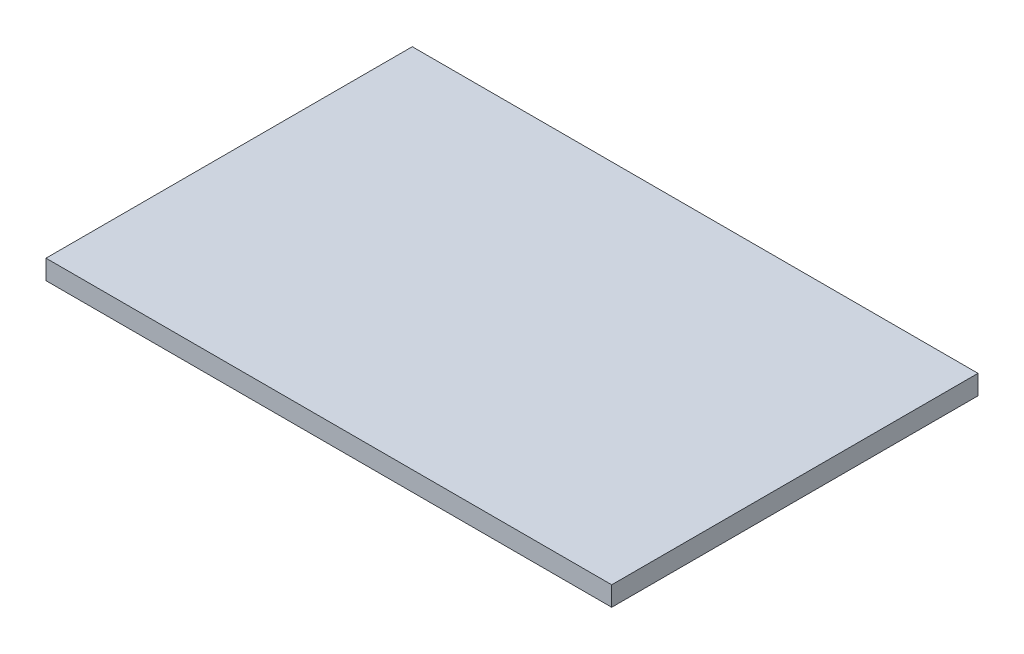
ISO-10303-21;
HEADER;
FILE_DESCRIPTION(('STEP AP214'),'2;1');
FILE_NAME('part.step','',(''),(''),'','','');
FILE_SCHEMA(('AUTOMOTIVE_DESIGN { 1 0 10303 214 1 1 1 1 }'));
ENDSEC;
DATA;
#1=APPLICATION_CONTEXT('core data for automotive mechanical design processes');
#2=APPLICATION_PROTOCOL_DEFINITION('international standard','automotive_design',2000,#1);
#3=PRODUCT_CONTEXT('',#1,'mechanical');
#4=PRODUCT('Part','Part','',(#3));
#5=PRODUCT_RELATED_PRODUCT_CATEGORY('part','',(#4));
#6=PRODUCT_DEFINITION_FORMATION('','',#4);
#7=PRODUCT_DEFINITION_CONTEXT('part definition',#1,'design');
#8=PRODUCT_DEFINITION('design','',#6,#7);
#9=PRODUCT_DEFINITION_SHAPE('','',#8);
#10=(LENGTH_UNIT() NAMED_UNIT(*) SI_UNIT(.MILLI.,.METRE.));
#11=(NAMED_UNIT(*) PLANE_ANGLE_UNIT() SI_UNIT($,.RADIAN.));
#12=(NAMED_UNIT(*) SI_UNIT($,.STERADIAN.) SOLID_ANGLE_UNIT());
#13=UNCERTAINTY_MEASURE_WITH_UNIT(LENGTH_MEASURE(1.E-05),#10,'distance_accuracy_value','');
#14=(GEOMETRIC_REPRESENTATION_CONTEXT(3) GLOBAL_UNCERTAINTY_ASSIGNED_CONTEXT((#13)) GLOBAL_UNIT_ASSIGNED_CONTEXT((#10,
#11,#12)) REPRESENTATION_CONTEXT('',''));
#15=CARTESIAN_POINT('',(0.,0.,0.));
#16=DIRECTION('',(0.,0.,1.));
#17=DIRECTION('',(1.,0.,0.));
#18=AXIS2_PLACEMENT_3D('',#15,#16,#17);
#19=CARTESIAN_POINT('',(21.02,1.45,-11.515));
#20=DIRECTION('',(0.,0.,1.));
#21=DIRECTION('',(1.,0.,0.));
#22=AXIS2_PLACEMENT_3D('',#19,#20,#21);
#23=PLANE('',#22);
#24=DIRECTION('',(-1.,0.,0.));
#25=VECTOR('',#24,1.);
#26=CARTESIAN_POINT('',(21.02,0.,-11.515));
#27=LINE('',#26,#25);
#28=CARTESIAN_POINT('',(21.02,0.,-11.515));
#29=VERTEX_POINT('',#28);
#30=CARTESIAN_POINT('',(-21.02,0.,-11.515));
#31=VERTEX_POINT('',#30);
#32=EDGE_CURVE('E96',#29,#31,#27,.T.);
#33=ORIENTED_EDGE('',*,*,#32,.T.);
#34=DIRECTION('',(0.,-1.,0.));
#35=VECTOR('',#34,1.);
#36=CARTESIAN_POINT('',(-21.02,1.45,-11.515));
#37=LINE('',#36,#35);
#38=CARTESIAN_POINT('',(-21.02,1.45,-11.515));
#39=VERTEX_POINT('',#38);
#40=EDGE_CURVE('E11',#39,#31,#37,.T.);
#41=ORIENTED_EDGE('',*,*,#40,.F.);
#42=DIRECTION('',(-1.,0.,0.));
#43=VECTOR('',#42,1.);
#44=CARTESIAN_POINT('',(21.02,1.45,-11.515));
#45=LINE('',#44,#43);
#46=CARTESIAN_POINT('',(21.02,1.45,-11.515));
#47=VERTEX_POINT('',#46);
#48=EDGE_CURVE('E84',#47,#39,#45,.T.);
#49=ORIENTED_EDGE('',*,*,#48,.F.);
#50=DIRECTION('',(0.,-1.,0.));
#51=VECTOR('',#50,1.);
#52=CARTESIAN_POINT('',(21.02,1.45,-11.515));
#53=LINE('',#52,#51);
#54=EDGE_CURVE('E92',#47,#29,#53,.T.);
#55=ORIENTED_EDGE('',*,*,#54,.T.);
#56=EDGE_LOOP('',(#33,#41,#49,#55));
#57=FACE_BOUND('',#56,.T.);
#58=ADVANCED_FACE('F33',(#57),#23,.F.);
#59=CARTESIAN_POINT('',(-21.02,1.45,-11.515));
#60=DIRECTION('',(1.,0.,0.));
#61=DIRECTION('',(0.,0.,-1.));
#62=AXIS2_PLACEMENT_3D('',#59,#60,#61);
#63=PLANE('',#62);
#64=DIRECTION('',(0.,0.,1.));
#65=VECTOR('',#64,1.);
#66=CARTESIAN_POINT('',(-21.02,0.,-11.515));
#67=LINE('',#66,#65);
#68=CARTESIAN_POINT('',(-21.02,0.,15.705));
#69=VERTEX_POINT('',#68);
#70=EDGE_CURVE('E88',#31,#69,#67,.T.);
#71=ORIENTED_EDGE('',*,*,#70,.T.);
#72=DIRECTION('',(0.,-1.,0.));
#73=VECTOR('',#72,1.);
#74=CARTESIAN_POINT('',(-21.02,1.45,15.705));
#75=LINE('',#74,#73);
#76=CARTESIAN_POINT('',(-21.02,1.45,15.705));
#77=VERTEX_POINT('',#76);
#78=EDGE_CURVE('E41',#77,#69,#75,.T.);
#79=ORIENTED_EDGE('',*,*,#78,.F.);
#80=DIRECTION('',(0.,0.,1.));
#81=VECTOR('',#80,1.);
#82=CARTESIAN_POINT('',(-21.02,1.45,-11.515));
#83=LINE('',#82,#81);
#84=EDGE_CURVE('E79',#39,#77,#83,.T.);
#85=ORIENTED_EDGE('',*,*,#84,.F.);
#86=ORIENTED_EDGE('',*,*,#40,.T.);
#87=EDGE_LOOP('',(#71,#79,#85,#86));
#88=FACE_BOUND('',#87,.T.);
#89=ADVANCED_FACE('F87',(#88),#63,.F.);
#90=CARTESIAN_POINT('',(-21.02,1.45,15.705));
#91=DIRECTION('',(0.,0.,-1.));
#92=DIRECTION('',(-1.,0.,0.));
#93=AXIS2_PLACEMENT_3D('',#90,#91,#92);
#94=PLANE('',#93);
#95=DIRECTION('',(1.,0.,0.));
#96=VECTOR('',#95,1.);
#97=CARTESIAN_POINT('',(-21.02,0.,15.705));
#98=LINE('',#97,#96);
#99=CARTESIAN_POINT('',(21.02,0.,15.705));
#100=VERTEX_POINT('',#99);
#101=EDGE_CURVE('E66',#69,#100,#98,.T.);
#102=ORIENTED_EDGE('',*,*,#101,.T.);
#103=DIRECTION('',(0.,-1.,0.));
#104=VECTOR('',#103,1.);
#105=CARTESIAN_POINT('',(21.02,1.45,15.705));
#106=LINE('',#105,#104);
#107=CARTESIAN_POINT('',(21.02,1.45,15.705));
#108=VERTEX_POINT('',#107);
#109=EDGE_CURVE('E89',#108,#100,#106,.T.);
#110=ORIENTED_EDGE('',*,*,#109,.F.);
#111=DIRECTION('',(1.,0.,0.));
#112=VECTOR('',#111,1.);
#113=CARTESIAN_POINT('',(-21.02,1.45,15.705));
#114=LINE('',#113,#112);
#115=EDGE_CURVE('E82',#77,#108,#114,.T.);
#116=ORIENTED_EDGE('',*,*,#115,.F.);
#117=ORIENTED_EDGE('',*,*,#78,.T.);
#118=EDGE_LOOP('',(#102,#110,#116,#117));
#119=FACE_BOUND('',#118,.T.);
#120=ADVANCED_FACE('F90',(#119),#94,.F.);
#121=CARTESIAN_POINT('',(21.02,1.45,15.705));
#122=DIRECTION('',(-1.,0.,0.));
#123=DIRECTION('',(0.,0.,1.));
#124=AXIS2_PLACEMENT_3D('',#121,#122,#123);
#125=PLANE('',#124);
#126=DIRECTION('',(0.,0.,-1.));
#127=VECTOR('',#126,1.);
#128=CARTESIAN_POINT('',(21.02,0.,15.705));
#129=LINE('',#128,#127);
#130=EDGE_CURVE('E72',#100,#29,#129,.T.);
#131=ORIENTED_EDGE('',*,*,#130,.T.);
#132=ORIENTED_EDGE('',*,*,#54,.F.);
#133=DIRECTION('',(0.,0.,-1.));
#134=VECTOR('',#133,1.);
#135=CARTESIAN_POINT('',(21.02,1.45,15.705));
#136=LINE('',#135,#134);
#137=EDGE_CURVE('E49',#108,#47,#136,.T.);
#138=ORIENTED_EDGE('',*,*,#137,.F.);
#139=ORIENTED_EDGE('',*,*,#109,.T.);
#140=EDGE_LOOP('',(#131,#132,#138,#139));
#141=FACE_BOUND('',#140,.T.);
#142=ADVANCED_FACE('F103',(#141),#125,.F.);
#143=CARTESIAN_POINT('',(0.,1.45,0.));
#144=DIRECTION('',(0.,1.,0.));
#145=DIRECTION('',(0.,0.,1.));
#146=AXIS2_PLACEMENT_3D('',#143,#144,#145);
#147=PLANE('',#146);
#148=ORIENTED_EDGE('',*,*,#48,.T.);
#149=ORIENTED_EDGE('',*,*,#84,.T.);
#150=ORIENTED_EDGE('',*,*,#115,.T.);
#151=ORIENTED_EDGE('',*,*,#137,.T.);
#152=EDGE_LOOP('',(#148,#149,#150,#151));
#153=FACE_BOUND('',#152,.T.);
#154=ADVANCED_FACE('F80',(#153),#147,.T.);
#155=CARTESIAN_POINT('',(0.,0.,0.));
#156=DIRECTION('',(0.,1.,0.));
#157=DIRECTION('',(0.,0.,1.));
#158=AXIS2_PLACEMENT_3D('',#155,#156,#157);
#159=PLANE('',#158);
#160=ORIENTED_EDGE('',*,*,#32,.F.);
#161=ORIENTED_EDGE('',*,*,#130,.F.);
#162=ORIENTED_EDGE('',*,*,#101,.F.);
#163=ORIENTED_EDGE('',*,*,#70,.F.);
#164=EDGE_LOOP('',(#160,#161,#162,#163));
#165=FACE_BOUND('',#164,.T.);
#166=ADVANCED_FACE('F106',(#165),#159,.F.);
#167=CLOSED_SHELL('',(#58,#89,#120,#142,#154,#166));
#168=MANIFOLD_SOLID_BREP('B2',#167);
#169=ADVANCED_BREP_SHAPE_REPRESENTATION('',(#18,#168),#14);
#170=SHAPE_DEFINITION_REPRESENTATION(#9,#169);
ENDSEC;
END-ISO-10303-21;
